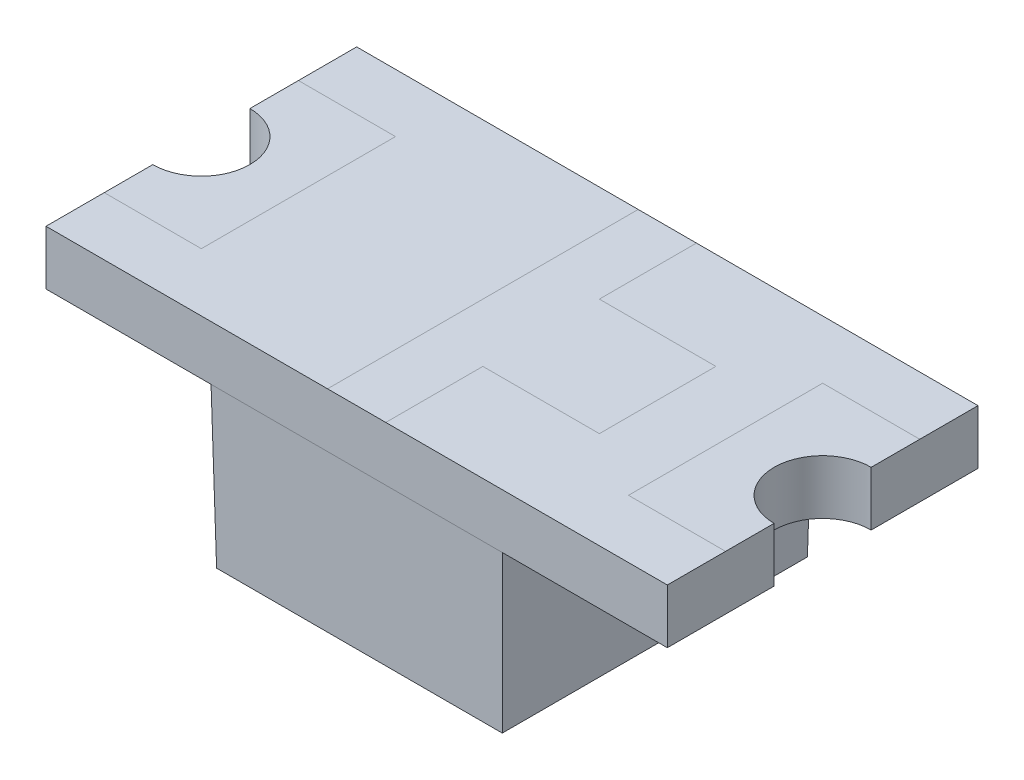
ISO-10303-21;
HEADER;
FILE_DESCRIPTION(('STEP AP214'),'2;1');
FILE_NAME('part.step','',(''),(''),'','','');
FILE_SCHEMA(('AUTOMOTIVE_DESIGN { 1 0 10303 214 1 1 1 1 }'));
ENDSEC;
DATA;
#1=APPLICATION_CONTEXT('core data for automotive mechanical design processes');
#2=APPLICATION_PROTOCOL_DEFINITION('international standard','automotive_design',2000,#1);
#3=PRODUCT_CONTEXT('',#1,'mechanical');
#4=PRODUCT('Part','Part','',(#3));
#5=PRODUCT_RELATED_PRODUCT_CATEGORY('part','',(#4));
#6=PRODUCT_DEFINITION_FORMATION('','',#4);
#7=PRODUCT_DEFINITION_CONTEXT('part definition',#1,'design');
#8=PRODUCT_DEFINITION('design','',#6,#7);
#9=PRODUCT_DEFINITION_SHAPE('','',#8);
#10=(LENGTH_UNIT() NAMED_UNIT(*) SI_UNIT(.MILLI.,.METRE.));
#11=(NAMED_UNIT(*) PLANE_ANGLE_UNIT() SI_UNIT($,.RADIAN.));
#12=(NAMED_UNIT(*) SI_UNIT($,.STERADIAN.) SOLID_ANGLE_UNIT());
#13=UNCERTAINTY_MEASURE_WITH_UNIT(LENGTH_MEASURE(1.E-05),#10,'distance_accuracy_value','');
#14=(GEOMETRIC_REPRESENTATION_CONTEXT(3) GLOBAL_UNCERTAINTY_ASSIGNED_CONTEXT((#13)) GLOBAL_UNIT_ASSIGNED_CONTEXT((#10,
#11,#12)) REPRESENTATION_CONTEXT('',''));
#15=CARTESIAN_POINT('',(0.,0.,0.));
#16=DIRECTION('',(0.,0.,1.));
#17=DIRECTION('',(1.,0.,0.));
#18=AXIS2_PLACEMENT_3D('',#15,#16,#17);
#19=CARTESIAN_POINT('',(0.15,-0.2,0.1));
#20=DIRECTION('',(1.,0.,0.));
#21=DIRECTION('',(0.,0.,-1.));
#22=AXIS2_PLACEMENT_3D('',#19,#20,#21);
#23=PLANE('',#22);
#24=DIRECTION('',(0.,0.,-1.));
#25=VECTOR('',#24,1.);
#26=CARTESIAN_POINT('',(0.15,0.,0.1));
#27=LINE('',#26,#25);
#28=CARTESIAN_POINT('',(0.15,0.,0.1));
#29=VERTEX_POINT('',#28);
#30=CARTESIAN_POINT('',(0.15,0.,-0.1));
#31=VERTEX_POINT('',#30);
#32=EDGE_CURVE('E114',#29,#31,#27,.T.);
#33=ORIENTED_EDGE('',*,*,#32,.T.);
#34=DIRECTION('',(0.,1.,0.));
#35=VECTOR('',#34,1.);
#36=CARTESIAN_POINT('',(0.15,-0.2,-0.1));
#37=LINE('',#36,#35);
#38=CARTESIAN_POINT('',(0.15,-0.2,-0.1));
#39=VERTEX_POINT('',#38);
#40=EDGE_CURVE('E12',#39,#31,#37,.T.);
#41=ORIENTED_EDGE('',*,*,#40,.F.);
#42=DIRECTION('',(0.,0.,-1.));
#43=VECTOR('',#42,1.);
#44=CARTESIAN_POINT('',(0.15,-0.2,0.1));
#45=LINE('',#44,#43);
#46=CARTESIAN_POINT('',(0.15,-0.2,0.1));
#47=VERTEX_POINT('',#46);
#48=EDGE_CURVE('E102',#47,#39,#45,.T.);
#49=ORIENTED_EDGE('',*,*,#48,.F.);
#50=DIRECTION('',(0.,1.,0.));
#51=VECTOR('',#50,1.);
#52=CARTESIAN_POINT('',(0.15,-0.2,0.1));
#53=LINE('',#52,#51);
#54=EDGE_CURVE('E110',#47,#29,#53,.T.);
#55=ORIENTED_EDGE('',*,*,#54,.T.);
#56=EDGE_LOOP('',(#33,#41,#49,#55));
#57=FACE_BOUND('',#56,.T.);
#58=ADVANCED_FACE('F51',(#57),#23,.F.);
#59=CARTESIAN_POINT('',(0.15,-0.2,-0.1));
#60=DIRECTION('',(0.,0.,1.));
#61=DIRECTION('',(1.,0.,0.));
#62=AXIS2_PLACEMENT_3D('',#59,#60,#61);
#63=PLANE('',#62);
#64=DIRECTION('',(1.,0.,0.));
#65=VECTOR('',#64,1.);
#66=CARTESIAN_POINT('',(0.15,0.,-0.1));
#67=LINE('',#66,#65);
#68=CARTESIAN_POINT('',(0.35,0.,-0.1));
#69=VERTEX_POINT('',#68);
#70=EDGE_CURVE('E106',#31,#69,#67,.T.);
#71=ORIENTED_EDGE('',*,*,#70,.T.);
#72=DIRECTION('',(0.,1.,0.));
#73=VECTOR('',#72,1.);
#74=CARTESIAN_POINT('',(0.35,-0.2,-0.1));
#75=LINE('',#74,#73);
#76=CARTESIAN_POINT('',(0.35,-0.2,-0.1));
#77=VERTEX_POINT('',#76);
#78=EDGE_CURVE('E59',#77,#69,#75,.T.);
#79=ORIENTED_EDGE('',*,*,#78,.F.);
#80=DIRECTION('',(1.,0.,0.));
#81=VECTOR('',#80,1.);
#82=CARTESIAN_POINT('',(0.15,-0.2,-0.1));
#83=LINE('',#82,#81);
#84=EDGE_CURVE('E97',#39,#77,#83,.T.);
#85=ORIENTED_EDGE('',*,*,#84,.F.);
#86=ORIENTED_EDGE('',*,*,#40,.T.);
#87=EDGE_LOOP('',(#71,#79,#85,#86));
#88=FACE_BOUND('',#87,.T.);
#89=ADVANCED_FACE('F105',(#88),#63,.F.);
#90=CARTESIAN_POINT('',(0.35,-0.2,0.1));
#91=DIRECTION('',(-1.,0.,0.));
#92=DIRECTION('',(0.,0.,1.));
#93=AXIS2_PLACEMENT_3D('',#90,#91,#92);
#94=PLANE('',#93);
#95=DIRECTION('',(0.,0.,1.));
#96=VECTOR('',#95,1.);
#97=CARTESIAN_POINT('',(0.35,0.,0.1));
#98=LINE('',#97,#96);
#99=CARTESIAN_POINT('',(0.35,0.,0.1));
#100=VERTEX_POINT('',#99);
#101=EDGE_CURVE('E84',#69,#100,#98,.T.);
#102=ORIENTED_EDGE('',*,*,#101,.T.);
#103=DIRECTION('',(0.,1.,0.));
#104=VECTOR('',#103,1.);
#105=CARTESIAN_POINT('',(0.35,-0.2,0.1));
#106=LINE('',#105,#104);
#107=CARTESIAN_POINT('',(0.35,-0.2,0.1));
#108=VERTEX_POINT('',#107);
#109=EDGE_CURVE('E107',#108,#100,#106,.T.);
#110=ORIENTED_EDGE('',*,*,#109,.F.);
#111=DIRECTION('',(0.,0.,1.));
#112=VECTOR('',#111,1.);
#113=CARTESIAN_POINT('',(0.35,-0.2,0.1));
#114=LINE('',#113,#112);
#115=EDGE_CURVE('E100',#77,#108,#114,.T.);
#116=ORIENTED_EDGE('',*,*,#115,.F.);
#117=ORIENTED_EDGE('',*,*,#78,.T.);
#118=EDGE_LOOP('',(#102,#110,#116,#117));
#119=FACE_BOUND('',#118,.T.);
#120=ADVANCED_FACE('F108',(#119),#94,.F.);
#121=CARTESIAN_POINT('',(0.15,-0.2,0.1));
#122=DIRECTION('',(0.,0.,-1.));
#123=DIRECTION('',(-1.,0.,0.));
#124=AXIS2_PLACEMENT_3D('',#121,#122,#123);
#125=PLANE('',#124);
#126=DIRECTION('',(-1.,0.,0.));
#127=VECTOR('',#126,1.);
#128=CARTESIAN_POINT('',(0.15,0.,0.1));
#129=LINE('',#128,#127);
#130=EDGE_CURVE('E90',#100,#29,#129,.T.);
#131=ORIENTED_EDGE('',*,*,#130,.T.);
#132=ORIENTED_EDGE('',*,*,#54,.F.);
#133=DIRECTION('',(-1.,0.,0.));
#134=VECTOR('',#133,1.);
#135=CARTESIAN_POINT('',(0.15,-0.2,0.1));
#136=LINE('',#135,#134);
#137=EDGE_CURVE('E67',#108,#47,#136,.T.);
#138=ORIENTED_EDGE('',*,*,#137,.F.);
#139=ORIENTED_EDGE('',*,*,#109,.T.);
#140=EDGE_LOOP('',(#131,#132,#138,#139));
#141=FACE_BOUND('',#140,.T.);
#142=ADVANCED_FACE('F121',(#141),#125,.F.);
#143=CARTESIAN_POINT('',(0.,-0.2,0.));
#144=DIRECTION('',(0.,-1.,0.));
#145=DIRECTION('',(0.,0.,-1.));
#146=AXIS2_PLACEMENT_3D('',#143,#144,#145);
#147=PLANE('',#146);
#148=ORIENTED_EDGE('',*,*,#48,.T.);
#149=ORIENTED_EDGE('',*,*,#84,.T.);
#150=ORIENTED_EDGE('',*,*,#115,.T.);
#151=ORIENTED_EDGE('',*,*,#137,.T.);
#152=EDGE_LOOP('',(#148,#149,#150,#151));
#153=FACE_BOUND('',#152,.T.);
#154=ADVANCED_FACE('F98',(#153),#147,.T.);
#155=CARTESIAN_POINT('',(0.,0.,0.));
#156=DIRECTION('',(0.,-1.,0.));
#157=DIRECTION('',(0.,0.,-1.));
#158=AXIS2_PLACEMENT_3D('',#155,#156,#157);
#159=PLANE('',#158);
#160=ORIENTED_EDGE('',*,*,#32,.F.);
#161=ORIENTED_EDGE('',*,*,#130,.F.);
#162=ORIENTED_EDGE('',*,*,#101,.F.);
#163=ORIENTED_EDGE('',*,*,#70,.F.);
#164=EDGE_LOOP('',(#160,#161,#162,#163));
#165=FACE_BOUND('',#164,.T.);
#166=ADVANCED_FACE('F124',(#165),#159,.F.);
#167=CLOSED_SHELL('',(#58,#89,#120,#142,#154,#166));
#168=MANIFOLD_SOLID_BREP('B2',#167);
#169=CARTESIAN_POINT('',(-0.75,0.,0.8));
#170=DIRECTION('',(-0.999847695156391,-0.0174524064372835,0.));
#171=DIRECTION('',(0.0174524064372835,-0.999847695156391,0.));
#172=AXIS2_PLACEMENT_3D('',#169,#170,#171);
#173=PLANE('',#172);
#174=DIRECTION('',(0.,0.,-1.));
#175=VECTOR('',#174,1.);
#176=CARTESIAN_POINT('',(-0.75,0.,0.8));
#177=LINE('',#176,#175);
#178=CARTESIAN_POINT('',(-0.75,0.,0.8));
#179=VERTEX_POINT('',#178);
#180=CARTESIAN_POINT('',(-0.75,0.,-0.8));
#181=VERTEX_POINT('',#180);
#182=EDGE_CURVE('E241',#179,#181,#177,.T.);
#183=ORIENTED_EDGE('',*,*,#182,.T.);
#184=DIRECTION('',(-0.0174497491606827,0.999695459881887,-0.0174497491606827));
#185=VECTOR('',#184,1.);
#186=CARTESIAN_POINT('',(-0.75,0.,-0.8));
#187=LINE('',#186,#185);
#188=CARTESIAN_POINT('',(-0.735686846758862,-0.82,-0.785686846758862));
#189=VERTEX_POINT('',#188);
#190=EDGE_CURVE('E49',#189,#181,#187,.T.);
#191=ORIENTED_EDGE('',*,*,#190,.F.);
#192=DIRECTION('',(0.,0.,1.));
#193=VECTOR('',#192,1.);
#194=CARTESIAN_POINT('',(-0.735686846758862,-0.82,0.8));
#195=LINE('',#194,#193);
#196=CARTESIAN_POINT('',(-0.735686846758862,-0.82,0.785686846758862));
#197=VERTEX_POINT('',#196);
#198=EDGE_CURVE('E257',#197,#189,#195,.F.);
#199=ORIENTED_EDGE('',*,*,#198,.F.);
#200=DIRECTION('',(-0.0174497491606827,0.999695459881887,0.0174497491606827));
#201=VECTOR('',#200,1.);
#202=CARTESIAN_POINT('',(-0.75,0.,0.8));
#203=LINE('',#202,#201);
#204=EDGE_CURVE('E252',#197,#179,#203,.T.);
#205=ORIENTED_EDGE('',*,*,#204,.T.);
#206=EDGE_LOOP('',(#183,#191,#199,#205));
#207=FACE_BOUND('',#206,.T.);
#208=ADVANCED_FACE('F195',(#207),#173,.T.);
#209=CARTESIAN_POINT('',(-0.75,0.,-0.8));
#210=DIRECTION('',(0.,-0.0174524064372835,-0.999847695156391));
#211=DIRECTION('',(0.,0.999847695156391,-0.0174524064372835));
#212=AXIS2_PLACEMENT_3D('',#209,#210,#211);
#213=PLANE('',#212);
#214=DIRECTION('',(1.,0.,0.));
#215=VECTOR('',#214,1.);
#216=CARTESIAN_POINT('',(-0.75,0.,-0.8));
#217=LINE('',#216,#215);
#218=CARTESIAN_POINT('',(0.75,0.,-0.8));
#219=VERTEX_POINT('',#218);
#220=EDGE_CURVE('E237',#181,#219,#217,.T.);
#221=ORIENTED_EDGE('',*,*,#220,.T.);
#222=DIRECTION('',(0.0174497491606827,0.999695459881887,-0.0174497491606827));
#223=VECTOR('',#222,1.);
#224=CARTESIAN_POINT('',(0.749512810006767,-0.0279110960192197,-0.799512810006767));
#225=LINE('',#224,#223);
#226=CARTESIAN_POINT('',(0.735686846758862,-0.82,-0.785686846758862));
#227=VERTEX_POINT('',#226);
#228=EDGE_CURVE('E204',#227,#219,#225,.T.);
#229=ORIENTED_EDGE('',*,*,#228,.F.);
#230=DIRECTION('',(-1.,0.,0.));
#231=VECTOR('',#230,1.);
#232=CARTESIAN_POINT('',(-0.75,-0.82,-0.785686846758862));
#233=LINE('',#232,#231);
#234=EDGE_CURVE('E248',#189,#227,#233,.F.);
#235=ORIENTED_EDGE('',*,*,#234,.F.);
#236=ORIENTED_EDGE('',*,*,#190,.T.);
#237=EDGE_LOOP('',(#221,#229,#235,#236));
#238=FACE_BOUND('',#237,.T.);
#239=ADVANCED_FACE('F197',(#238),#213,.T.);
#240=CARTESIAN_POINT('',(0.75,0.,0.8));
#241=DIRECTION('',(0.999847695156391,-0.0174524064372835,0.));
#242=DIRECTION('',(0.0174524064372835,0.999847695156391,0.));
#243=AXIS2_PLACEMENT_3D('',#240,#241,#242);
#244=PLANE('',#243);
#245=DIRECTION('',(0.,0.,1.));
#246=VECTOR('',#245,1.);
#247=CARTESIAN_POINT('',(0.75,0.,0.8));
#248=LINE('',#247,#246);
#249=CARTESIAN_POINT('',(0.75,0.,0.8));
#250=VERTEX_POINT('',#249);
#251=EDGE_CURVE('E242',#219,#250,#248,.T.);
#252=ORIENTED_EDGE('',*,*,#251,.T.);
#253=DIRECTION('',(0.0174497491606827,0.999695459881887,0.0174497491606827));
#254=VECTOR('',#253,1.);
#255=CARTESIAN_POINT('',(0.749543259381344,-0.0261666525180184,0.799543259381344));
#256=LINE('',#255,#254);
#257=CARTESIAN_POINT('',(0.735686846758862,-0.82,0.785686846758862));
#258=VERTEX_POINT('',#257);
#259=EDGE_CURVE('E260',#258,#250,#256,.T.);
#260=ORIENTED_EDGE('',*,*,#259,.F.);
#261=DIRECTION('',(0.,0.,-1.));
#262=VECTOR('',#261,1.);
#263=CARTESIAN_POINT('',(0.735686846758862,-0.82,0.8));
#264=LINE('',#263,#262);
#265=EDGE_CURVE('E216',#227,#258,#264,.F.);
#266=ORIENTED_EDGE('',*,*,#265,.F.);
#267=ORIENTED_EDGE('',*,*,#228,.T.);
#268=EDGE_LOOP('',(#252,#260,#266,#267));
#269=FACE_BOUND('',#268,.T.);
#270=ADVANCED_FACE('F267',(#269),#244,.T.);
#271=CARTESIAN_POINT('',(-0.75,0.,0.8));
#272=DIRECTION('',(0.,-0.0174524064372835,0.999847695156391));
#273=DIRECTION('',(0.,-0.999847695156391,-0.0174524064372835));
#274=AXIS2_PLACEMENT_3D('',#271,#272,#273);
#275=PLANE('',#274);
#276=DIRECTION('',(-1.,0.,0.));
#277=VECTOR('',#276,1.);
#278=CARTESIAN_POINT('',(-0.75,0.,0.8));
#279=LINE('',#278,#277);
#280=EDGE_CURVE('E256',#250,#179,#279,.T.);
#281=ORIENTED_EDGE('',*,*,#280,.T.);
#282=ORIENTED_EDGE('',*,*,#204,.F.);
#283=DIRECTION('',(1.,0.,0.));
#284=VECTOR('',#283,1.);
#285=CARTESIAN_POINT('',(-0.75,-0.82,0.785686846758862));
#286=LINE('',#285,#284);
#287=EDGE_CURVE('E199',#258,#197,#286,.F.);
#288=ORIENTED_EDGE('',*,*,#287,.F.);
#289=ORIENTED_EDGE('',*,*,#259,.T.);
#290=EDGE_LOOP('',(#281,#282,#288,#289));
#291=FACE_BOUND('',#290,.T.);
#292=ADVANCED_FACE('F269',(#291),#275,.T.);
#293=CARTESIAN_POINT('',(0.,-0.82,0.));
#294=DIRECTION('',(0.,-1.,0.));
#295=DIRECTION('',(0.,0.,-1.));
#296=AXIS2_PLACEMENT_3D('',#293,#294,#295);
#297=PLANE('',#296);
#298=ORIENTED_EDGE('',*,*,#198,.T.);
#299=ORIENTED_EDGE('',*,*,#234,.T.);
#300=ORIENTED_EDGE('',*,*,#265,.T.);
#301=ORIENTED_EDGE('',*,*,#287,.T.);
#302=EDGE_LOOP('',(#298,#299,#300,#301));
#303=FACE_BOUND('',#302,.T.);
#304=ADVANCED_FACE('F265',(#303),#297,.T.);
#305=CARTESIAN_POINT('',(0.,0.,0.));
#306=DIRECTION('',(0.,-1.,0.));
#307=DIRECTION('',(0.,0.,-1.));
#308=AXIS2_PLACEMENT_3D('',#305,#306,#307);
#309=PLANE('',#308);
#310=ORIENTED_EDGE('',*,*,#182,.F.);
#311=ORIENTED_EDGE('',*,*,#280,.F.);
#312=ORIENTED_EDGE('',*,*,#251,.F.);
#313=ORIENTED_EDGE('',*,*,#220,.F.);
#314=EDGE_LOOP('',(#310,#311,#312,#313));
#315=FACE_BOUND('',#314,.T.);
#316=ADVANCED_FACE('F238',(#315),#309,.F.);
#317=CLOSED_SHELL('',(#208,#239,#270,#292,#304,#316));
#318=MANIFOLD_SOLID_BREP('B6',#317);
#319=CARTESIAN_POINT('',(-1.6,0.28,-0.8));
#320=DIRECTION('',(1.,0.,0.));
#321=DIRECTION('',(0.,0.,-1.));
#322=AXIS2_PLACEMENT_3D('',#319,#320,#321);
#323=PLANE('',#322);
#324=DIRECTION('',(0.,0.,1.));
#325=VECTOR('',#324,1.);
#326=CARTESIAN_POINT('',(-1.6,0.,-0.8));
#327=LINE('',#326,#325);
#328=CARTESIAN_POINT('',(-1.6,0.,-0.8));
#329=VERTEX_POINT('',#328);
#330=CARTESIAN_POINT('',(-1.6,0.,-0.25));
#331=VERTEX_POINT('',#330);
#332=EDGE_CURVE('E596',#329,#331,#327,.T.);
#333=ORIENTED_EDGE('',*,*,#332,.T.);
#334=DIRECTION('',(0.,1.,0.));
#335=VECTOR('',#334,1.);
#336=CARTESIAN_POINT('',(-1.6,-0.82,-0.25));
#337=LINE('',#336,#335);
#338=CARTESIAN_POINT('',(-1.6,0.28,-0.25));
#339=VERTEX_POINT('',#338);
#340=EDGE_CURVE('E353',#331,#339,#337,.T.);
#341=ORIENTED_EDGE('',*,*,#340,.T.);
#342=DIRECTION('',(0.,0.,1.));
#343=VECTOR('',#342,1.);
#344=CARTESIAN_POINT('',(-1.6,0.28,-0.8));
#345=LINE('',#344,#343);
#346=CARTESIAN_POINT('',(-1.6,0.28,-0.5));
#347=VERTEX_POINT('',#346);
#348=EDGE_CURVE('E468',#347,#339,#345,.T.);
#349=ORIENTED_EDGE('',*,*,#348,.F.);
#350=CARTESIAN_POINT('',(-1.6,0.28,-0.8));
#351=VERTEX_POINT('',#350);
#352=EDGE_CURVE('E475',#351,#347,#345,.T.);
#353=ORIENTED_EDGE('',*,*,#352,.F.);
#354=DIRECTION('',(0.,-1.,0.));
#355=VECTOR('',#354,1.);
#356=CARTESIAN_POINT('',(-1.6,0.28,-0.8));
#357=LINE('',#356,#355);
#358=EDGE_CURVE('E515',#351,#329,#357,.T.);
#359=ORIENTED_EDGE('',*,*,#358,.T.);
#360=EDGE_LOOP('',(#333,#341,#349,#353,#359));
#361=FACE_BOUND('',#360,.T.);
#362=ADVANCED_FACE('F330',(#361),#323,.F.);
#363=CARTESIAN_POINT('',(1.6,0.28,-0.8));
#364=DIRECTION('',(-1.,0.,0.));
#365=DIRECTION('',(0.,0.,1.));
#366=AXIS2_PLACEMENT_3D('',#363,#364,#365);
#367=PLANE('',#366);
#368=DIRECTION('',(0.,0.,-1.));
#369=VECTOR('',#368,1.);
#370=CARTESIAN_POINT('',(1.6,0.,-0.8));
#371=LINE('',#370,#369);
#372=CARTESIAN_POINT('',(1.6,0.,0.8));
#373=VERTEX_POINT('',#372);
#374=CARTESIAN_POINT('',(1.6,0.,0.25));
#375=VERTEX_POINT('',#374);
#376=EDGE_CURVE('E589',#373,#375,#371,.T.);
#377=ORIENTED_EDGE('',*,*,#376,.T.);
#378=DIRECTION('',(0.,1.,0.));
#379=VECTOR('',#378,1.);
#380=CARTESIAN_POINT('',(1.6,-0.82,0.25));
#381=LINE('',#380,#379);
#382=CARTESIAN_POINT('',(1.6,0.28,0.25));
#383=VERTEX_POINT('',#382);
#384=EDGE_CURVE('E193',#375,#383,#381,.T.);
#385=ORIENTED_EDGE('',*,*,#384,.T.);
#386=DIRECTION('',(0.,0.,-1.));
#387=VECTOR('',#386,1.);
#388=CARTESIAN_POINT('',(1.6,0.28,-0.8));
#389=LINE('',#388,#387);
#390=CARTESIAN_POINT('',(1.6,0.28,0.5));
#391=VERTEX_POINT('',#390);
#392=EDGE_CURVE('E496',#391,#383,#389,.T.);
#393=ORIENTED_EDGE('',*,*,#392,.F.);
#394=CARTESIAN_POINT('',(1.6,0.28,0.8));
#395=VERTEX_POINT('',#394);
#396=EDGE_CURVE('E501',#395,#391,#389,.T.);
#397=ORIENTED_EDGE('',*,*,#396,.F.);
#398=DIRECTION('',(0.,-1.,0.));
#399=VECTOR('',#398,1.);
#400=CARTESIAN_POINT('',(1.6,0.28,0.8));
#401=LINE('',#400,#399);
#402=EDGE_CURVE('E524',#395,#373,#401,.T.);
#403=ORIENTED_EDGE('',*,*,#402,.T.);
#404=EDGE_LOOP('',(#377,#385,#393,#397,#403));
#405=FACE_BOUND('',#404,.T.);
#406=ADVANCED_FACE('F603',(#405),#367,.F.);
#407=CARTESIAN_POINT('',(0.,0.,0.));
#408=DIRECTION('',(0.,1.,0.));
#409=DIRECTION('',(0.,0.,1.));
#410=AXIS2_PLACEMENT_3D('',#407,#408,#409);
#411=PLANE('',#410);
#412=DIRECTION('',(0.,0.,-1.));
#413=VECTOR('',#412,1.);
#414=CARTESIAN_POINT('',(0.75,0.,0.));
#415=LINE('',#414,#413);
#416=CARTESIAN_POINT('',(0.75,0.,0.8));
#417=VERTEX_POINT('',#416);
#418=CARTESIAN_POINT('',(0.75,0.,-0.8));
#419=VERTEX_POINT('',#418);
#420=EDGE_CURVE('E575',#417,#419,#415,.T.);
#421=ORIENTED_EDGE('',*,*,#420,.F.);
#422=DIRECTION('',(1.,0.,0.));
#423=VECTOR('',#422,1.);
#424=CARTESIAN_POINT('',(-1.6,0.,0.8));
#425=LINE('',#424,#423);
#426=CARTESIAN_POINT('',(-0.75,0.,0.8));
#427=VERTEX_POINT('',#426);
#428=EDGE_CURVE('E593',#427,#417,#425,.T.);
#429=ORIENTED_EDGE('',*,*,#428,.F.);
#430=DIRECTION('',(0.,0.,1.));
#431=VECTOR('',#430,1.);
#432=CARTESIAN_POINT('',(-0.75,0.,0.));
#433=LINE('',#432,#431);
#434=CARTESIAN_POINT('',(-0.75,0.,-0.8));
#435=VERTEX_POINT('',#434);
#436=EDGE_CURVE('E572',#435,#427,#433,.T.);
#437=ORIENTED_EDGE('',*,*,#436,.F.);
#438=DIRECTION('',(-1.,0.,0.));
#439=VECTOR('',#438,1.);
#440=CARTESIAN_POINT('',(-1.6,0.,-0.8));
#441=LINE('',#440,#439);
#442=EDGE_CURVE('E614',#419,#435,#441,.T.);
#443=ORIENTED_EDGE('',*,*,#442,.F.);
#444=EDGE_LOOP('',(#421,#429,#437,#443));
#445=FACE_BOUND('',#444,.T.);
#446=ADVANCED_FACE('F612',(#445),#411,.F.);
#447=CARTESIAN_POINT('',(1.6,0.,-0.25));
#448=VERTEX_POINT('',#447);
#449=CARTESIAN_POINT('',(1.6,0.,-0.8));
#450=VERTEX_POINT('',#449);
#451=EDGE_CURVE('E582',#448,#450,#371,.T.);
#452=ORIENTED_EDGE('',*,*,#451,.F.);
#453=CARTESIAN_POINT('',(1.6,0.,0.));
#454=DIRECTION('',(0.,1.,0.));
#455=DIRECTION('',(0.,0.,1.));
#456=AXIS2_PLACEMENT_3D('',#453,#454,#455);
#457=CIRCLE('',#456,0.25);
#458=EDGE_CURVE('E345',#448,#375,#457,.T.);
#459=ORIENTED_EDGE('',*,*,#458,.T.);
#460=ORIENTED_EDGE('',*,*,#376,.F.);
#461=EDGE_CURVE('E595',#417,#373,#425,.T.);
#462=ORIENTED_EDGE('',*,*,#461,.F.);
#463=ORIENTED_EDGE('',*,*,#420,.T.);
#464=EDGE_CURVE('E476',#450,#419,#441,.T.);
#465=ORIENTED_EDGE('',*,*,#464,.F.);
#466=EDGE_LOOP('',(#452,#459,#460,#462,#463,#465));
#467=FACE_BOUND('',#466,.T.);
#468=ADVANCED_FACE('F585',(#467),#411,.F.);
#469=CARTESIAN_POINT('',(0.,0.28,0.));
#470=DIRECTION('',(0.,1.,0.));
#471=DIRECTION('',(0.,0.,1.));
#472=AXIS2_PLACEMENT_3D('',#469,#470,#471);
#473=PLANE('',#472);
#474=ORIENTED_EDGE('',*,*,#396,.T.);
#475=DIRECTION('',(-1.,0.,0.));
#476=VECTOR('',#475,1.);
#477=CARTESIAN_POINT('',(0.,0.28,0.5));
#478=LINE('',#477,#476);
#479=CARTESIAN_POINT('',(1.1,0.28,0.5));
#480=VERTEX_POINT('',#479);
#481=EDGE_CURVE('E569',#391,#480,#478,.T.);
#482=ORIENTED_EDGE('',*,*,#481,.T.);
#483=DIRECTION('',(0.,0.,-1.));
#484=VECTOR('',#483,1.);
#485=CARTESIAN_POINT('',(1.1,0.28,0.));
#486=LINE('',#485,#484);
#487=CARTESIAN_POINT('',(1.1,0.28,-0.5));
#488=VERTEX_POINT('',#487);
#489=EDGE_CURVE('E562',#480,#488,#486,.T.);
#490=ORIENTED_EDGE('',*,*,#489,.T.);
#491=DIRECTION('',(1.,0.,0.));
#492=VECTOR('',#491,1.);
#493=CARTESIAN_POINT('',(0.,0.28,-0.5));
#494=LINE('',#493,#492);
#495=CARTESIAN_POINT('',(1.6,0.28,-0.5));
#496=VERTEX_POINT('',#495);
#497=EDGE_CURVE('E566',#488,#496,#494,.T.);
#498=ORIENTED_EDGE('',*,*,#497,.T.);
#499=CARTESIAN_POINT('',(1.6,0.28,-0.8));
#500=VERTEX_POINT('',#499);
#501=EDGE_CURVE('E493',#496,#500,#389,.T.);
#502=ORIENTED_EDGE('',*,*,#501,.T.);
#503=DIRECTION('',(-1.,0.,0.));
#504=VECTOR('',#503,1.);
#505=CARTESIAN_POINT('',(-1.6,0.28,-0.8));
#506=LINE('',#505,#504);
#507=CARTESIAN_POINT('',(0.15,0.28,-0.8));
#508=VERTEX_POINT('',#507);
#509=EDGE_CURVE('E510',#500,#508,#506,.T.);
#510=ORIENTED_EDGE('',*,*,#509,.T.);
#511=DIRECTION('',(0.,0.,1.));
#512=VECTOR('',#511,1.);
#513=CARTESIAN_POINT('',(0.15,0.28,0.));
#514=LINE('',#513,#512);
#515=CARTESIAN_POINT('',(0.15,0.28,-0.3));
#516=VERTEX_POINT('',#515);
#517=EDGE_CURVE('E556',#508,#516,#514,.T.);
#518=ORIENTED_EDGE('',*,*,#517,.T.);
#519=DIRECTION('',(1.,0.,0.));
#520=VECTOR('',#519,1.);
#521=CARTESIAN_POINT('',(0.,0.28,-0.3));
#522=LINE('',#521,#520);
#523=CARTESIAN_POINT('',(0.75,0.28,-0.3));
#524=VERTEX_POINT('',#523);
#525=EDGE_CURVE('E553',#516,#524,#522,.T.);
#526=ORIENTED_EDGE('',*,*,#525,.T.);
#527=DIRECTION('',(0.,0.,1.));
#528=VECTOR('',#527,1.);
#529=CARTESIAN_POINT('',(0.75,0.28,0.));
#530=LINE('',#529,#528);
#531=CARTESIAN_POINT('',(0.75,0.28,0.3));
#532=VERTEX_POINT('',#531);
#533=EDGE_CURVE('E550',#524,#532,#530,.T.);
#534=ORIENTED_EDGE('',*,*,#533,.T.);
#535=DIRECTION('',(-1.,0.,0.));
#536=VECTOR('',#535,1.);
#537=CARTESIAN_POINT('',(0.,0.28,0.3));
#538=LINE('',#537,#536);
#539=CARTESIAN_POINT('',(0.15,0.28,0.3));
#540=VERTEX_POINT('',#539);
#541=EDGE_CURVE('E547',#532,#540,#538,.T.);
#542=ORIENTED_EDGE('',*,*,#541,.T.);
#543=DIRECTION('',(0.,0.,1.));
#544=VECTOR('',#543,1.);
#545=CARTESIAN_POINT('',(0.15,0.28,0.));
#546=LINE('',#545,#544);
#547=CARTESIAN_POINT('',(0.15,0.28,0.8));
#548=VERTEX_POINT('',#547);
#549=EDGE_CURVE('E544',#540,#548,#546,.T.);
#550=ORIENTED_EDGE('',*,*,#549,.T.);
#551=DIRECTION('',(1.,0.,0.));
#552=VECTOR('',#551,1.);
#553=CARTESIAN_POINT('',(-1.6,0.28,0.8));
#554=LINE('',#553,#552);
#555=EDGE_CURVE('E480',#548,#395,#554,.T.);
#556=ORIENTED_EDGE('',*,*,#555,.T.);
#557=EDGE_LOOP('',(#474,#482,#490,#498,#502,#510,#518,#526,#534,#542,#550,#556));
#558=FACE_BOUND('',#557,.T.);
#559=ADVANCED_FACE('F628',(#558),#473,.T.);
#560=CARTESIAN_POINT('',(-1.6,0.28,0.8));
#561=VERTEX_POINT('',#560);
#562=CARTESIAN_POINT('',(-0.15,0.28,0.8));
#563=VERTEX_POINT('',#562);
#564=EDGE_CURVE('E485',#561,#563,#554,.T.);
#565=ORIENTED_EDGE('',*,*,#564,.T.);
#566=DIRECTION('',(0.,0.,-1.));
#567=VECTOR('',#566,1.);
#568=CARTESIAN_POINT('',(-0.15,0.28,0.));
#569=LINE('',#568,#567);
#570=CARTESIAN_POINT('',(-0.15,0.28,-0.8));
#571=VERTEX_POINT('',#570);
#572=EDGE_CURVE('E559',#563,#571,#569,.T.);
#573=ORIENTED_EDGE('',*,*,#572,.T.);
#574=EDGE_CURVE('E507',#571,#351,#506,.T.);
#575=ORIENTED_EDGE('',*,*,#574,.T.);
#576=ORIENTED_EDGE('',*,*,#352,.T.);
#577=DIRECTION('',(1.,0.,0.));
#578=VECTOR('',#577,1.);
#579=CARTESIAN_POINT('',(0.,0.28,-0.5));
#580=LINE('',#579,#578);
#581=CARTESIAN_POINT('',(-1.1,0.28,-0.5));
#582=VERTEX_POINT('',#581);
#583=EDGE_CURVE('E534',#347,#582,#580,.T.);
#584=ORIENTED_EDGE('',*,*,#583,.T.);
#585=DIRECTION('',(0.,0.,1.));
#586=VECTOR('',#585,1.);
#587=CARTESIAN_POINT('',(-1.1,0.28,0.));
#588=LINE('',#587,#586);
#589=CARTESIAN_POINT('',(-1.1,0.28,0.5));
#590=VERTEX_POINT('',#589);
#591=EDGE_CURVE('E537',#582,#590,#588,.T.);
#592=ORIENTED_EDGE('',*,*,#591,.T.);
#593=DIRECTION('',(-1.,0.,0.));
#594=VECTOR('',#593,1.);
#595=CARTESIAN_POINT('',(0.,0.28,0.5));
#596=LINE('',#595,#594);
#597=CARTESIAN_POINT('',(-1.6,0.28,0.5));
#598=VERTEX_POINT('',#597);
#599=EDGE_CURVE('E541',#590,#598,#596,.T.);
#600=ORIENTED_EDGE('',*,*,#599,.T.);
#601=EDGE_CURVE('E473',#598,#561,#345,.T.);
#602=ORIENTED_EDGE('',*,*,#601,.T.);
#603=EDGE_LOOP('',(#565,#573,#575,#576,#584,#592,#600,#602));
#604=FACE_BOUND('',#603,.T.);
#605=ADVANCED_FACE('F625',(#604),#473,.T.);
#606=CARTESIAN_POINT('',(1.6,0.28,0.));
#607=DIRECTION('',(0.,1.,0.));
#608=DIRECTION('',(0.,0.,1.));
#609=AXIS2_PLACEMENT_3D('',#606,#607,#608);
#610=CIRCLE('',#609,0.25);
#611=CARTESIAN_POINT('',(1.6,0.28,-0.25));
#612=VERTEX_POINT('',#611);
#613=EDGE_CURVE('E469',#612,#383,#610,.T.);
#614=ORIENTED_EDGE('',*,*,#613,.F.);
#615=EDGE_CURVE('E495',#612,#496,#389,.T.);
#616=ORIENTED_EDGE('',*,*,#615,.T.);
#617=ORIENTED_EDGE('',*,*,#497,.F.);
#618=ORIENTED_EDGE('',*,*,#489,.F.);
#619=ORIENTED_EDGE('',*,*,#481,.F.);
#620=ORIENTED_EDGE('',*,*,#392,.T.);
#621=EDGE_LOOP('',(#614,#616,#617,#618,#619,#620));
#622=FACE_BOUND('',#621,.T.);
#623=ADVANCED_FACE('F627',(#622),#473,.T.);
#624=ORIENTED_EDGE('',*,*,#572,.F.);
#625=EDGE_CURVE('E484',#563,#548,#554,.T.);
#626=ORIENTED_EDGE('',*,*,#625,.T.);
#627=ORIENTED_EDGE('',*,*,#549,.F.);
#628=ORIENTED_EDGE('',*,*,#541,.F.);
#629=ORIENTED_EDGE('',*,*,#533,.F.);
#630=ORIENTED_EDGE('',*,*,#525,.F.);
#631=ORIENTED_EDGE('',*,*,#517,.F.);
#632=EDGE_CURVE('E509',#508,#571,#506,.T.);
#633=ORIENTED_EDGE('',*,*,#632,.T.);
#634=EDGE_LOOP('',(#624,#626,#627,#628,#629,#630,#631,#633));
#635=FACE_BOUND('',#634,.T.);
#636=ADVANCED_FACE('F622',(#635),#473,.T.);
#637=CARTESIAN_POINT('',(-1.6,0.28,0.25));
#638=VERTEX_POINT('',#637);
#639=EDGE_CURVE('E465',#638,#598,#345,.T.);
#640=ORIENTED_EDGE('',*,*,#639,.F.);
#641=DIRECTION('',(0.,1.,0.));
#642=VECTOR('',#641,1.);
#643=CARTESIAN_POINT('',(-1.6,-0.82,0.25));
#644=LINE('',#643,#642);
#645=CARTESIAN_POINT('',(-1.6,0.,0.25));
#646=VERTEX_POINT('',#645);
#647=EDGE_CURVE('E453',#638,#646,#644,.F.);
#648=ORIENTED_EDGE('',*,*,#647,.T.);
#649=CARTESIAN_POINT('',(-1.6,0.,0.8));
#650=VERTEX_POINT('',#649);
#651=EDGE_CURVE('E597',#646,#650,#327,.T.);
#652=ORIENTED_EDGE('',*,*,#651,.T.);
#653=DIRECTION('',(0.,-1.,0.));
#654=VECTOR('',#653,1.);
#655=CARTESIAN_POINT('',(-1.6,0.28,0.8));
#656=LINE('',#655,#654);
#657=EDGE_CURVE('E531',#561,#650,#656,.T.);
#658=ORIENTED_EDGE('',*,*,#657,.F.);
#659=ORIENTED_EDGE('',*,*,#601,.F.);
#660=EDGE_LOOP('',(#640,#648,#652,#658,#659));
#661=FACE_BOUND('',#660,.T.);
#662=ADVANCED_FACE('F332',(#661),#323,.F.);
#663=CARTESIAN_POINT('',(-1.6,0.28,0.8));
#664=DIRECTION('',(0.,0.,-1.));
#665=DIRECTION('',(-1.,0.,0.));
#666=AXIS2_PLACEMENT_3D('',#663,#664,#665);
#667=PLANE('',#666);
#668=EDGE_CURVE('E590',#650,#427,#425,.T.);
#669=ORIENTED_EDGE('',*,*,#668,.T.);
#670=ORIENTED_EDGE('',*,*,#428,.T.);
#671=ORIENTED_EDGE('',*,*,#461,.T.);
#672=ORIENTED_EDGE('',*,*,#402,.F.);
#673=ORIENTED_EDGE('',*,*,#555,.F.);
#674=ORIENTED_EDGE('',*,*,#625,.F.);
#675=ORIENTED_EDGE('',*,*,#564,.F.);
#676=ORIENTED_EDGE('',*,*,#657,.T.);
#677=EDGE_LOOP('',(#669,#670,#671,#672,#673,#674,#675,#676));
#678=FACE_BOUND('',#677,.T.);
#679=ADVANCED_FACE('F609',(#678),#667,.F.);
#680=ORIENTED_EDGE('',*,*,#615,.F.);
#681=DIRECTION('',(0.,1.,0.));
#682=VECTOR('',#681,1.);
#683=CARTESIAN_POINT('',(1.6,-0.82,-0.25));
#684=LINE('',#683,#682);
#685=EDGE_CURVE('E338',#612,#448,#684,.F.);
#686=ORIENTED_EDGE('',*,*,#685,.T.);
#687=ORIENTED_EDGE('',*,*,#451,.T.);
#688=DIRECTION('',(0.,-1.,0.));
#689=VECTOR('',#688,1.);
#690=CARTESIAN_POINT('',(1.6,0.28,-0.8));
#691=LINE('',#690,#689);
#692=EDGE_CURVE('E518',#500,#450,#691,.T.);
#693=ORIENTED_EDGE('',*,*,#692,.F.);
#694=ORIENTED_EDGE('',*,*,#501,.F.);
#695=EDGE_LOOP('',(#680,#686,#687,#693,#694));
#696=FACE_BOUND('',#695,.T.);
#697=ADVANCED_FACE('F581',(#696),#367,.F.);
#698=CARTESIAN_POINT('',(-1.6,0.28,-0.8));
#699=DIRECTION('',(0.,0.,1.));
#700=DIRECTION('',(1.,0.,0.));
#701=AXIS2_PLACEMENT_3D('',#698,#699,#700);
#702=PLANE('',#701);
#703=ORIENTED_EDGE('',*,*,#464,.T.);
#704=ORIENTED_EDGE('',*,*,#442,.T.);
#705=EDGE_CURVE('E591',#435,#329,#441,.T.);
#706=ORIENTED_EDGE('',*,*,#705,.T.);
#707=ORIENTED_EDGE('',*,*,#358,.F.);
#708=ORIENTED_EDGE('',*,*,#574,.F.);
#709=ORIENTED_EDGE('',*,*,#632,.F.);
#710=ORIENTED_EDGE('',*,*,#509,.F.);
#711=ORIENTED_EDGE('',*,*,#692,.T.);
#712=EDGE_LOOP('',(#703,#704,#706,#707,#708,#709,#710,#711));
#713=FACE_BOUND('',#712,.T.);
#714=ADVANCED_FACE('F616',(#713),#702,.F.);
#715=CARTESIAN_POINT('',(-1.6,0.28,0.));
#716=DIRECTION('',(0.,1.,0.));
#717=DIRECTION('',(0.,0.,1.));
#718=AXIS2_PLACEMENT_3D('',#715,#716,#717);
#719=CIRCLE('',#718,0.25);
#720=EDGE_CURVE('E456',#638,#339,#719,.T.);
#721=ORIENTED_EDGE('',*,*,#720,.F.);
#722=ORIENTED_EDGE('',*,*,#639,.T.);
#723=ORIENTED_EDGE('',*,*,#599,.F.);
#724=ORIENTED_EDGE('',*,*,#591,.F.);
#725=ORIENTED_EDGE('',*,*,#583,.F.);
#726=ORIENTED_EDGE('',*,*,#348,.T.);
#727=EDGE_LOOP('',(#721,#722,#723,#724,#725,#726));
#728=FACE_BOUND('',#727,.T.);
#729=ADVANCED_FACE('F464',(#728),#473,.T.);
#730=ORIENTED_EDGE('',*,*,#651,.F.);
#731=CARTESIAN_POINT('',(-1.6,0.,0.));
#732=DIRECTION('',(0.,1.,0.));
#733=DIRECTION('',(0.,0.,1.));
#734=AXIS2_PLACEMENT_3D('',#731,#732,#733);
#735=CIRCLE('',#734,0.25);
#736=EDGE_CURVE('E457',#646,#331,#735,.T.);
#737=ORIENTED_EDGE('',*,*,#736,.T.);
#738=ORIENTED_EDGE('',*,*,#332,.F.);
#739=ORIENTED_EDGE('',*,*,#705,.F.);
#740=ORIENTED_EDGE('',*,*,#436,.T.);
#741=ORIENTED_EDGE('',*,*,#668,.F.);
#742=EDGE_LOOP('',(#730,#737,#738,#739,#740,#741));
#743=FACE_BOUND('',#742,.T.);
#744=ADVANCED_FACE('F618',(#743),#411,.F.);
#745=CARTESIAN_POINT('',(-1.6,-0.82,0.));
#746=DIRECTION('',(0.,1.,0.));
#747=DIRECTION('',(0.,0.,1.));
#748=AXIS2_PLACEMENT_3D('',#745,#746,#747);
#749=CYLINDRICAL_SURFACE('',#748,0.25);
#750=ORIENTED_EDGE('',*,*,#736,.F.);
#751=ORIENTED_EDGE('',*,*,#647,.F.);
#752=ORIENTED_EDGE('',*,*,#720,.T.);
#753=ORIENTED_EDGE('',*,*,#340,.F.);
#754=EDGE_LOOP('',(#750,#751,#752,#753));
#755=FACE_BOUND('',#754,.T.);
#756=ADVANCED_FACE('F455',(#755),#749,.F.);
#757=CARTESIAN_POINT('',(1.6,-0.82,0.));
#758=DIRECTION('',(0.,1.,0.));
#759=DIRECTION('',(0.,0.,1.));
#760=AXIS2_PLACEMENT_3D('',#757,#758,#759);
#761=CYLINDRICAL_SURFACE('',#760,0.25);
#762=ORIENTED_EDGE('',*,*,#458,.F.);
#763=ORIENTED_EDGE('',*,*,#685,.F.);
#764=ORIENTED_EDGE('',*,*,#613,.T.);
#765=ORIENTED_EDGE('',*,*,#384,.F.);
#766=EDGE_LOOP('',(#762,#763,#764,#765));
#767=FACE_BOUND('',#766,.T.);
#768=ADVANCED_FACE('F601',(#767),#761,.F.);
#769=CLOSED_SHELL('',(#362,#406,#446,#468,#559,#605,#623,#636,#662,#679,#697,#714,#729,#744,
#756,#768));
#770=MANIFOLD_SOLID_BREP('B43',#769);
#771=ADVANCED_BREP_SHAPE_REPRESENTATION('',(#18,#168,#318,#770),#14);
#772=SHAPE_DEFINITION_REPRESENTATION(#9,#771);
ENDSEC;
END-ISO-10303-21;
